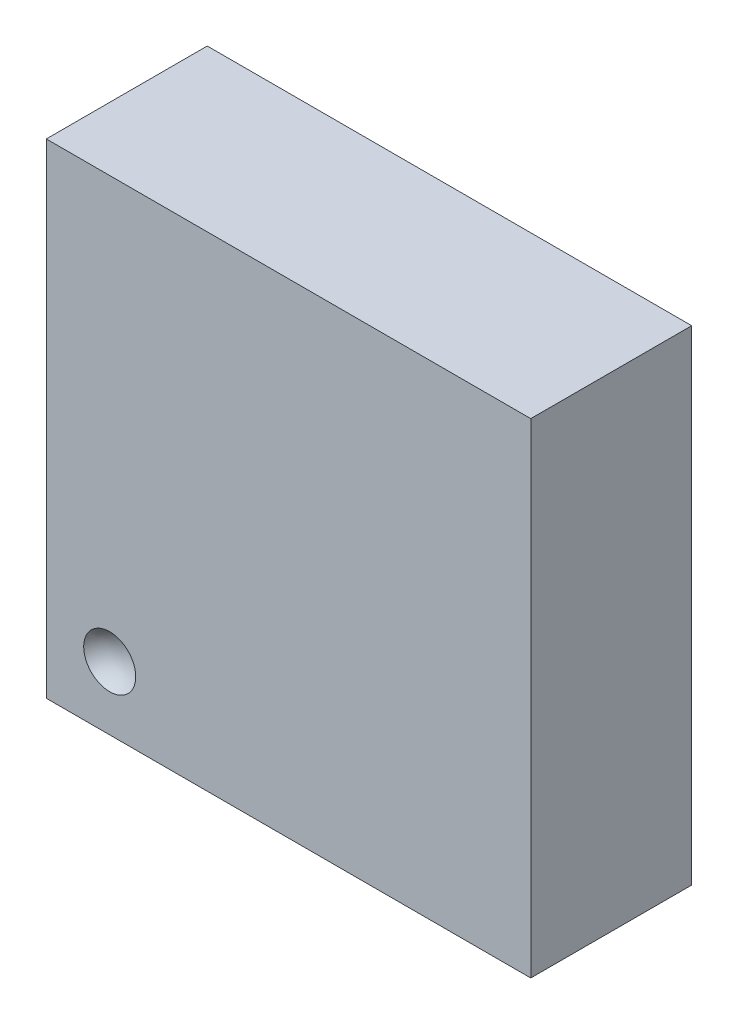
ISO-10303-21;
HEADER;
FILE_DESCRIPTION(('STEP AP214'),'2;1');
FILE_NAME('part.step','',(''),(''),'','','');
FILE_SCHEMA(('AUTOMOTIVE_DESIGN { 1 0 10303 214 1 1 1 1 }'));
ENDSEC;
DATA;
#1=APPLICATION_CONTEXT('core data for automotive mechanical design processes');
#2=APPLICATION_PROTOCOL_DEFINITION('international standard','automotive_design',2000,#1);
#3=PRODUCT_CONTEXT('',#1,'mechanical');
#4=PRODUCT('Part','Part','',(#3));
#5=PRODUCT_RELATED_PRODUCT_CATEGORY('part','',(#4));
#6=PRODUCT_DEFINITION_FORMATION('','',#4);
#7=PRODUCT_DEFINITION_CONTEXT('part definition',#1,'design');
#8=PRODUCT_DEFINITION('design','',#6,#7);
#9=PRODUCT_DEFINITION_SHAPE('','',#8);
#10=(LENGTH_UNIT() NAMED_UNIT(*) SI_UNIT(.MILLI.,.METRE.));
#11=(NAMED_UNIT(*) PLANE_ANGLE_UNIT() SI_UNIT($,.RADIAN.));
#12=(NAMED_UNIT(*) SI_UNIT($,.STERADIAN.) SOLID_ANGLE_UNIT());
#13=UNCERTAINTY_MEASURE_WITH_UNIT(LENGTH_MEASURE(1.E-05),#10,'distance_accuracy_value','');
#14=(GEOMETRIC_REPRESENTATION_CONTEXT(3) GLOBAL_UNCERTAINTY_ASSIGNED_CONTEXT((#13)) GLOBAL_UNIT_ASSIGNED_CONTEXT((#10,
#11,#12)) REPRESENTATION_CONTEXT('',''));
#15=CARTESIAN_POINT('',(0.,0.,0.));
#16=DIRECTION('',(0.,0.,1.));
#17=DIRECTION('',(1.,0.,0.));
#18=AXIS2_PLACEMENT_3D('',#15,#16,#17);
#19=CARTESIAN_POINT('',(0.4,0.4,1.12));
#20=DIRECTION('',(0.,1.,0.));
#21=DIRECTION('',(0.,0.,1.));
#22=AXIS2_PLACEMENT_3D('',#19,#20,#21);
#23=SPHERICAL_SURFACE('',#22,0.1999996);
#24=CARTESIAN_POINT('',(0.240000101112141,0.399955776213647,1.00000054));
#25=CARTESIAN_POINT('',(0.240016958797769,0.382000846451223,1.00000054));
#26=CARTESIAN_POINT('',(0.243077268368103,0.3639830904153,1.00000054));
#27=CARTESIAN_POINT('',(0.254990985376109,0.33001172573785,1.00000054));
#28=CARTESIAN_POINT('',(0.263844392813781,0.314058117096324,1.00000054));
#29=CARTESIAN_POINT('',(0.286332426459102,0.285971243131585,1.00000054));
#30=CARTESIAN_POINT('',(0.299967052666753,0.273837977808373,1.00000054000001));
#31=CARTESIAN_POINT('',(0.330484000663222,0.254771099199416,1.00000054));
#32=CARTESIAN_POINT('',(0.347366322452041,0.24783748591367,1.00000053999999));
#33=CARTESIAN_POINT('',(0.382474322514545,0.239948575735127,1.00000054000001));
#34=CARTESIAN_POINT('',(0.40070000078823,0.238993278842331,1.00000054000002));
#35=CARTESIAN_POINT('',(0.436440170882991,0.243169520616723,1.00000053999998));
#36=CARTESIAN_POINT('',(0.453954662704067,0.248301059283912,1.00000053999991));
#37=CARTESIAN_POINT('',(0.486297763051865,0.264072211309639,1.00000054000009));
#38=CARTESIAN_POINT('',(0.501126371578653,0.274711824668041,1.00000054000035));
#39=CARTESIAN_POINT('',(0.526425911178983,0.300299648932064,1.00000054000035));
#40=CARTESIAN_POINT('',(0.5368968422523,0.315247859837907,1.0000005400001));
#41=CARTESIAN_POINT('',(0.552300503784195,0.347767566414074,1.00000053999991));
#42=CARTESIAN_POINT('',(0.557233234242919,0.365339062084329,1.00000053999998));
#43=CARTESIAN_POINT('',(0.561004368087755,0.401124288376722,1.00000054000002));
#44=CARTESIAN_POINT('',(0.559842771473868,0.419338018998861,1.00000054000001));
#45=CARTESIAN_POINT('',(0.551556211561901,0.45435425850538,1.00000053999999));
#46=CARTESIAN_POINT('',(0.544431248263822,0.471156767389761,1.00000054));
#47=CARTESIAN_POINT('',(0.525021242337546,0.501456191880955,1.00000054));
#48=CARTESIAN_POINT('',(0.512736199709349,0.514953107487769,1.00000054));
#49=CARTESIAN_POINT('',(0.484391074144092,0.537119731792039,1.00000054));
#50=CARTESIAN_POINT('',(0.468330991207031,0.545789440489496,1.00000054));
#51=CARTESIAN_POINT('',(0.434246461131594,0.557323978334533,1.00000054));
#52=CARTESIAN_POINT('',(0.416222013993217,0.560188807482113,1.00000054));
#53=CARTESIAN_POINT('',(0.380240787207291,0.559791452259213,1.00000054));
#54=CARTESIAN_POINT('',(0.362284007559741,0.556529267888731,1.00000054));
#55=CARTESIAN_POINT('',(0.328462934834954,0.544242485777343,1.00000054));
#56=CARTESIAN_POINT('',(0.312598641757717,0.535217888036436,1.00000054));
#57=CARTESIAN_POINT('',(0.284749895308756,0.512435625910722,1.00000054));
#58=CARTESIAN_POINT('',(0.272765441937031,0.498677961525917,1.00000054000002));
#59=CARTESIAN_POINT('',(0.25403210498171,0.467936257644813,1.00000054000002));
#60=CARTESIAN_POINT('',(0.247283221398121,0.450952218148509,1.00000054));
#61=CARTESIAN_POINT('',(0.241171212987417,0.422406571762263,1.00000054));
#62=CARTESIAN_POINT('',(0.239989550156423,0.411193479480579,1.00000054));
#63=CARTESIAN_POINT('',(0.240000101112141,0.399955776213647,1.00000054));
#64=B_SPLINE_CURVE_WITH_KNOTS('',3,(#24,#25,#26,#27,#28,#29,#30,#31,#32,#33,#34,#35,#36,#37,#38,
#39,#40,#41,#42,#43,#44,#45,#46,#47,#48,#49,#50,#51,#52,#53,#54,#55,#56,#57,#58,#59,#60,#61,#62,
#63),.UNSPECIFIED.,.T.,.F.,(4,2,2,2,2,2,2,2,2,2,2,2,2,2,2,2,2,2,2,4),(0.,0.0537233876181817,
0.107446775236363,0.161170162854551,0.214893550472728,0.26861693809091,0.322340325709092,
0.376063713325932,0.429787100945535,0.483510488563726,0.537233876181908,0.590957263800089,
0.644680651418272,0.698404039036453,0.752127426654635,0.805850814272816,0.859574201890998,
0.913297589509145,0.967020977127365,1.00064558588584),.UNSPECIFIED.);
#65=CARTESIAN_POINT('',(0.240000101112141,0.399955776213647,1.00000054));
#66=VERTEX_POINT('',#65);
#67=EDGE_CURVE('E22',#66,#66,#64,.T.);
#68=ORIENTED_EDGE('',*,*,#67,.T.);
#69=EDGE_LOOP('',(#68));
#70=FACE_BOUND('',#69,.T.);
#71=ADVANCED_FACE('F17',(#70),#23,.F.);
#72=CARTESIAN_POINT('',(0.00999998,2.9899991,1.00000054));
#73=DIRECTION('',(0.,0.,-1.));
#74=DIRECTION('',(-1.,0.,0.));
#75=AXIS2_PLACEMENT_3D('',#72,#73,#74);
#76=PLANE('',#75);
#77=ORIENTED_EDGE('',*,*,#67,.F.);
#78=EDGE_LOOP('',(#77));
#79=FACE_BOUND('',#78,.T.);
#80=DIRECTION('',(1.,0.,0.));
#81=VECTOR('',#80,1.);
#82=CARTESIAN_POINT('',(2.9899991,2.9899991,1.00000054));
#83=LINE('',#82,#81);
#84=CARTESIAN_POINT('',(2.9899991,2.9899991,1.00000054));
#85=VERTEX_POINT('',#84);
#86=CARTESIAN_POINT('',(0.00999998000000003,2.9899991,1.00000054));
#87=VERTEX_POINT('',#86);
#88=EDGE_CURVE('E58',#85,#87,#83,.F.);
#89=ORIENTED_EDGE('',*,*,#88,.T.);
#90=DIRECTION('',(0.,1.,0.));
#91=VECTOR('',#90,1.);
#92=CARTESIAN_POINT('',(0.00999998,2.9899991,1.00000054));
#93=LINE('',#92,#91);
#94=CARTESIAN_POINT('',(0.00999998,0.00999998000000008,1.00000054));
#95=VERTEX_POINT('',#94);
#96=EDGE_CURVE('E60',#87,#95,#93,.F.);
#97=ORIENTED_EDGE('',*,*,#96,.T.);
#98=DIRECTION('',(1.,0.,0.));
#99=VECTOR('',#98,1.);
#100=CARTESIAN_POINT('',(0.00999998,0.00999998,1.00000054));
#101=LINE('',#100,#99);
#102=CARTESIAN_POINT('',(2.9899991,0.00999998000000004,1.00000054));
#103=VERTEX_POINT('',#102);
#104=EDGE_CURVE('E63',#95,#103,#101,.T.);
#105=ORIENTED_EDGE('',*,*,#104,.T.);
#106=DIRECTION('',(0.,1.,0.));
#107=VECTOR('',#106,1.);
#108=CARTESIAN_POINT('',(2.9899991,0.00999998,1.00000054));
#109=LINE('',#108,#107);
#110=EDGE_CURVE('E88',#103,#85,#109,.T.);
#111=ORIENTED_EDGE('',*,*,#110,.T.);
#112=EDGE_LOOP('',(#89,#97,#105,#111));
#113=FACE_BOUND('',#112,.T.);
#114=ADVANCED_FACE('F62',(#79,#113),#76,.F.);
#115=CARTESIAN_POINT('',(0.00999998,0.00999998,0.00999998));
#116=DIRECTION('',(0.,1.,0.));
#117=DIRECTION('',(0.,0.,1.));
#118=AXIS2_PLACEMENT_3D('',#115,#116,#117);
#119=PLANE('',#118);
#120=ORIENTED_EDGE('',*,*,#104,.F.);
#121=DIRECTION('',(0.,0.,-1.));
#122=VECTOR('',#121,1.);
#123=CARTESIAN_POINT('',(0.00999998,0.00999998000000011,0.00999998));
#124=LINE('',#123,#122);
#125=CARTESIAN_POINT('',(0.00999998,0.00999998000000005,0.00999998));
#126=VERTEX_POINT('',#125);
#127=EDGE_CURVE('E68',#95,#126,#124,.T.);
#128=ORIENTED_EDGE('',*,*,#127,.T.);
#129=DIRECTION('',(-1.,0.,0.));
#130=VECTOR('',#129,1.);
#131=CARTESIAN_POINT('',(0.00999998,0.00999998000000011,0.00999998));
#132=LINE('',#131,#130);
#133=CARTESIAN_POINT('',(2.9899991,0.00999998000000004,0.00999998));
#134=VERTEX_POINT('',#133);
#135=EDGE_CURVE('E91',#134,#126,#132,.T.);
#136=ORIENTED_EDGE('',*,*,#135,.F.);
#137=DIRECTION('',(0.,0.,1.));
#138=VECTOR('',#137,1.);
#139=CARTESIAN_POINT('',(2.9899991,0.00999998000000003,0.00999998));
#140=LINE('',#139,#138);
#141=EDGE_CURVE('E74',#134,#103,#140,.T.);
#142=ORIENTED_EDGE('',*,*,#141,.T.);
#143=EDGE_LOOP('',(#120,#128,#136,#142));
#144=FACE_BOUND('',#143,.T.);
#145=ADVANCED_FACE('F71',(#144),#119,.F.);
#146=CARTESIAN_POINT('',(0.00999998,2.9899991,0.00999998));
#147=DIRECTION('',(1.,0.,0.));
#148=DIRECTION('',(0.,0.,-1.));
#149=AXIS2_PLACEMENT_3D('',#146,#147,#148);
#150=PLANE('',#149);
#151=ORIENTED_EDGE('',*,*,#96,.F.);
#152=DIRECTION('',(0.,0.,-1.));
#153=VECTOR('',#152,1.);
#154=CARTESIAN_POINT('',(0.00999998000000011,2.9899991,0.00999998));
#155=LINE('',#154,#153);
#156=CARTESIAN_POINT('',(0.00999998000000003,2.9899991,0.00999998));
#157=VERTEX_POINT('',#156);
#158=EDGE_CURVE('E82',#87,#157,#155,.T.);
#159=ORIENTED_EDGE('',*,*,#158,.T.);
#160=DIRECTION('',(0.,1.,0.));
#161=VECTOR('',#160,1.);
#162=CARTESIAN_POINT('',(0.00999998,2.9899991,0.00999998));
#163=LINE('',#162,#161);
#164=EDGE_CURVE('E79',#126,#157,#163,.T.);
#165=ORIENTED_EDGE('',*,*,#164,.F.);
#166=ORIENTED_EDGE('',*,*,#127,.F.);
#167=EDGE_LOOP('',(#151,#159,#165,#166));
#168=FACE_BOUND('',#167,.T.);
#169=ADVANCED_FACE('F77',(#168),#150,.F.);
#170=CARTESIAN_POINT('',(2.9899991,2.9899991,0.00999998));
#171=DIRECTION('',(0.,-1.,0.));
#172=DIRECTION('',(0.,0.,-1.));
#173=AXIS2_PLACEMENT_3D('',#170,#171,#172);
#174=PLANE('',#173);
#175=ORIENTED_EDGE('',*,*,#88,.F.);
#176=DIRECTION('',(0.,0.,1.));
#177=VECTOR('',#176,1.);
#178=CARTESIAN_POINT('',(2.9899991,2.9899991,0.00999998));
#179=LINE('',#178,#177);
#180=CARTESIAN_POINT('',(2.9899991,2.9899991,0.00999998));
#181=VERTEX_POINT('',#180);
#182=EDGE_CURVE('E38',#85,#181,#179,.F.);
#183=ORIENTED_EDGE('',*,*,#182,.T.);
#184=DIRECTION('',(-1.,0.,0.));
#185=VECTOR('',#184,1.);
#186=CARTESIAN_POINT('',(0.00999998,2.9899991,0.00999998));
#187=LINE('',#186,#185);
#188=EDGE_CURVE('E29',#157,#181,#187,.F.);
#189=ORIENTED_EDGE('',*,*,#188,.F.);
#190=ORIENTED_EDGE('',*,*,#158,.F.);
#191=EDGE_LOOP('',(#175,#183,#189,#190));
#192=FACE_BOUND('',#191,.T.);
#193=ADVANCED_FACE('F97',(#192),#174,.F.);
#194=CARTESIAN_POINT('',(2.9899991,0.00999998,0.00999998));
#195=DIRECTION('',(-1.,0.,0.));
#196=DIRECTION('',(0.,0.,1.));
#197=AXIS2_PLACEMENT_3D('',#194,#195,#196);
#198=PLANE('',#197);
#199=ORIENTED_EDGE('',*,*,#110,.F.);
#200=ORIENTED_EDGE('',*,*,#141,.F.);
#201=DIRECTION('',(0.,1.,0.));
#202=VECTOR('',#201,1.);
#203=CARTESIAN_POINT('',(2.9899991,2.9899991,0.00999998));
#204=LINE('',#203,#202);
#205=EDGE_CURVE('E11',#181,#134,#204,.F.);
#206=ORIENTED_EDGE('',*,*,#205,.F.);
#207=ORIENTED_EDGE('',*,*,#182,.F.);
#208=EDGE_LOOP('',(#199,#200,#206,#207));
#209=FACE_BOUND('',#208,.T.);
#210=ADVANCED_FACE('F99',(#209),#198,.F.);
#211=CARTESIAN_POINT('',(0.00999998,2.9899991,0.00999998));
#212=DIRECTION('',(0.,0.,-1.));
#213=DIRECTION('',(-1.,0.,0.));
#214=AXIS2_PLACEMENT_3D('',#211,#212,#213);
#215=PLANE('',#214);
#216=ORIENTED_EDGE('',*,*,#188,.T.);
#217=ORIENTED_EDGE('',*,*,#205,.T.);
#218=ORIENTED_EDGE('',*,*,#135,.T.);
#219=ORIENTED_EDGE('',*,*,#164,.T.);
#220=EDGE_LOOP('',(#216,#217,#218,#219));
#221=FACE_BOUND('',#220,.T.);
#222=ADVANCED_FACE('F96',(#221),#215,.T.);
#223=CLOSED_SHELL('',(#71,#114,#145,#169,#193,#210,#222));
#224=MANIFOLD_SOLID_BREP('B1',#223);
#225=ADVANCED_BREP_SHAPE_REPRESENTATION('',(#18,#224),#14);
#226=SHAPE_DEFINITION_REPRESENTATION(#9,#225);
ENDSEC;
END-ISO-10303-21;
